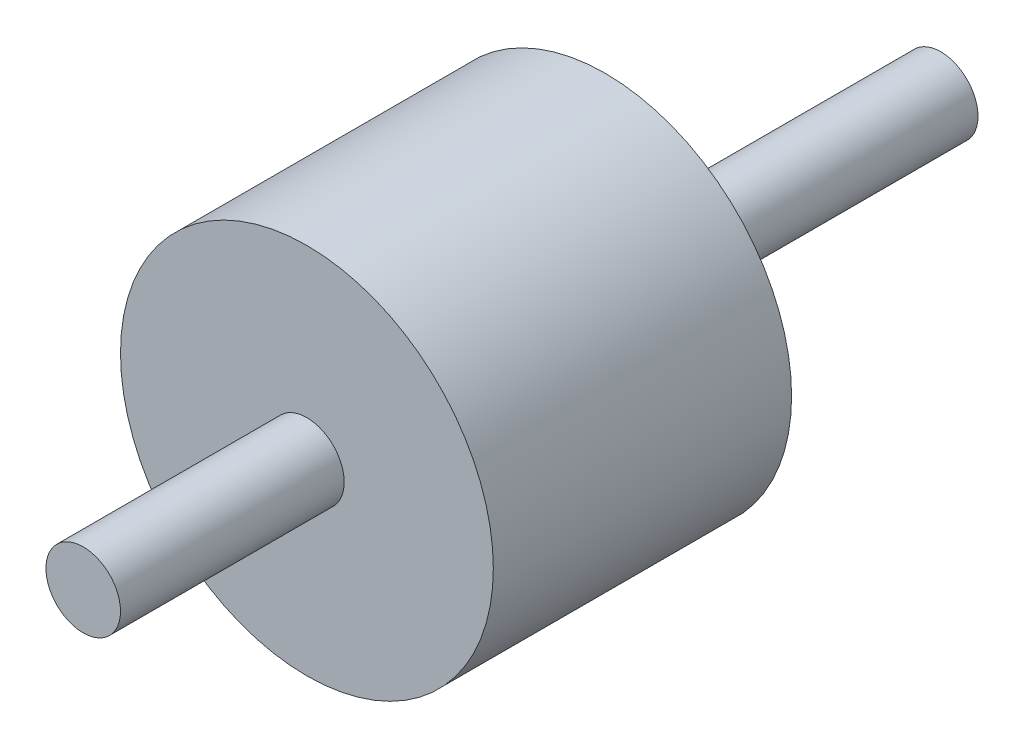
ISO-10303-21;
HEADER;
FILE_DESCRIPTION(('STEP AP214'),'2;1');
FILE_NAME('part.step','',(''),(''),'','','');
FILE_SCHEMA(('AUTOMOTIVE_DESIGN { 1 0 10303 214 1 1 1 1 }'));
ENDSEC;
DATA;
#1=APPLICATION_CONTEXT('core data for automotive mechanical design processes');
#2=APPLICATION_PROTOCOL_DEFINITION('international standard','automotive_design',2000,#1);
#3=PRODUCT_CONTEXT('',#1,'mechanical');
#4=PRODUCT('Part','Part','',(#3));
#5=PRODUCT_RELATED_PRODUCT_CATEGORY('part','',(#4));
#6=PRODUCT_DEFINITION_FORMATION('','',#4);
#7=PRODUCT_DEFINITION_CONTEXT('part definition',#1,'design');
#8=PRODUCT_DEFINITION('design','',#6,#7);
#9=PRODUCT_DEFINITION_SHAPE('','',#8);
#10=(LENGTH_UNIT() NAMED_UNIT(*) SI_UNIT(.MILLI.,.METRE.));
#11=(NAMED_UNIT(*) PLANE_ANGLE_UNIT() SI_UNIT($,.RADIAN.));
#12=(NAMED_UNIT(*) SI_UNIT($,.STERADIAN.) SOLID_ANGLE_UNIT());
#13=UNCERTAINTY_MEASURE_WITH_UNIT(LENGTH_MEASURE(1.E-05),#10,'distance_accuracy_value','');
#14=(GEOMETRIC_REPRESENTATION_CONTEXT(3) GLOBAL_UNCERTAINTY_ASSIGNED_CONTEXT((#13)) GLOBAL_UNIT_ASSIGNED_CONTEXT((#10,
#11,#12)) REPRESENTATION_CONTEXT('',''));
#15=CARTESIAN_POINT('',(0.,0.,0.));
#16=DIRECTION('',(0.,0.,1.));
#17=DIRECTION('',(1.,0.,0.));
#18=AXIS2_PLACEMENT_3D('',#15,#16,#17);
#19=CARTESIAN_POINT('',(0.,0.,45.));
#20=DIRECTION('',(0.,0.,1.));
#21=DIRECTION('',(1.,0.,0.));
#22=AXIS2_PLACEMENT_3D('',#19,#20,#21);
#23=CYLINDRICAL_SURFACE('',#22,25.);
#24=CARTESIAN_POINT('',(0.,0.,45.));
#25=DIRECTION('',(0.,0.,1.));
#26=DIRECTION('',(1.,0.,0.));
#27=AXIS2_PLACEMENT_3D('',#24,#25,#26);
#28=CIRCLE('',#27,25.);
#29=CARTESIAN_POINT('',(25.,0.,45.));
#30=VERTEX_POINT('',#29);
#31=EDGE_CURVE('E65',#30,#30,#28,.T.);
#32=ORIENTED_EDGE('',*,*,#31,.T.);
#33=EDGE_LOOP('',(#32));
#34=FACE_BOUND('',#33,.T.);
#35=CARTESIAN_POINT('',(0.,0.,85.));
#36=DIRECTION('',(0.,0.,1.));
#37=DIRECTION('',(1.,0.,0.));
#38=AXIS2_PLACEMENT_3D('',#35,#36,#37);
#39=CIRCLE('',#38,25.);
#40=CARTESIAN_POINT('',(25.,0.,85.));
#41=VERTEX_POINT('',#40);
#42=EDGE_CURVE('E61',#41,#41,#39,.T.);
#43=ORIENTED_EDGE('',*,*,#42,.F.);
#44=EDGE_LOOP('',(#43));
#45=FACE_BOUND('',#44,.T.);
#46=ADVANCED_FACE('F43',(#34,#45),#23,.T.);
#47=CARTESIAN_POINT('',(0.,0.,45.));
#48=DIRECTION('',(0.,0.,1.));
#49=DIRECTION('',(1.,0.,0.));
#50=AXIS2_PLACEMENT_3D('',#47,#48,#49);
#51=PLANE('',#50);
#52=CARTESIAN_POINT('',(0.,0.,45.));
#53=DIRECTION('',(0.,0.,-1.));
#54=DIRECTION('',(-1.,0.,0.));
#55=AXIS2_PLACEMENT_3D('',#52,#53,#54);
#56=CIRCLE('',#55,7.5);
#57=CARTESIAN_POINT('',(-7.5,0.,45.));
#58=VERTEX_POINT('',#57);
#59=EDGE_CURVE('E79',#58,#58,#56,.T.);
#60=ORIENTED_EDGE('',*,*,#59,.F.);
#61=EDGE_LOOP('',(#60));
#62=FACE_BOUND('',#61,.T.);
#63=ORIENTED_EDGE('',*,*,#31,.F.);
#64=EDGE_LOOP('',(#63));
#65=FACE_BOUND('',#64,.T.);
#66=ADVANCED_FACE('F108',(#62,#65),#51,.F.);
#67=CARTESIAN_POINT('',(0.,0.,85.));
#68=DIRECTION('',(0.,0.,1.));
#69=DIRECTION('',(1.,0.,0.));
#70=AXIS2_PLACEMENT_3D('',#67,#68,#69);
#71=PLANE('',#70);
#72=CARTESIAN_POINT('',(0.,0.,85.));
#73=DIRECTION('',(0.,0.,1.));
#74=DIRECTION('',(1.,0.,0.));
#75=AXIS2_PLACEMENT_3D('',#72,#73,#74);
#76=CIRCLE('',#75,5.);
#77=CARTESIAN_POINT('',(5.,0.,85.));
#78=VERTEX_POINT('',#77);
#79=EDGE_CURVE('E58',#78,#78,#76,.T.);
#80=ORIENTED_EDGE('',*,*,#79,.F.);
#81=EDGE_LOOP('',(#80));
#82=FACE_BOUND('',#81,.T.);
#83=ORIENTED_EDGE('',*,*,#42,.T.);
#84=EDGE_LOOP('',(#83));
#85=FACE_BOUND('',#84,.T.);
#86=ADVANCED_FACE('F114',(#82,#85),#71,.T.);
#87=CARTESIAN_POINT('',(0.,0.,115.));
#88=DIRECTION('',(0.,0.,1.));
#89=DIRECTION('',(1.,0.,0.));
#90=AXIS2_PLACEMENT_3D('',#87,#88,#89);
#91=PLANE('',#90);
#92=CARTESIAN_POINT('',(0.,0.,115.));
#93=DIRECTION('',(0.,0.,1.));
#94=DIRECTION('',(1.,0.,0.));
#95=AXIS2_PLACEMENT_3D('',#92,#93,#94);
#96=CIRCLE('',#95,5.);
#97=CARTESIAN_POINT('',(5.,0.,115.));
#98=VERTEX_POINT('',#97);
#99=EDGE_CURVE('E10',#98,#98,#96,.T.);
#100=ORIENTED_EDGE('',*,*,#99,.T.);
#101=EDGE_LOOP('',(#100));
#102=FACE_BOUND('',#101,.T.);
#103=ADVANCED_FACE('F105',(#102),#91,.T.);
#104=CARTESIAN_POINT('',(0.,0.,115.));
#105=DIRECTION('',(0.,0.,-1.));
#106=DIRECTION('',(-1.,0.,0.));
#107=AXIS2_PLACEMENT_3D('',#104,#105,#106);
#108=CYLINDRICAL_SURFACE('',#107,5.);
#109=ORIENTED_EDGE('',*,*,#79,.T.);
#110=EDGE_LOOP('',(#109));
#111=FACE_BOUND('',#110,.T.);
#112=ORIENTED_EDGE('',*,*,#99,.F.);
#113=EDGE_LOOP('',(#112));
#114=FACE_BOUND('',#113,.T.);
#115=ADVANCED_FACE('F45',(#111,#114),#108,.T.);
#116=CARTESIAN_POINT('',(0.,0.,45.));
#117=DIRECTION('',(0.,0.,-1.));
#118=DIRECTION('',(-1.,0.,0.));
#119=AXIS2_PLACEMENT_3D('',#116,#117,#118);
#120=CYLINDRICAL_SURFACE('',#119,7.5);
#121=ORIENTED_EDGE('',*,*,#59,.T.);
#122=EDGE_LOOP('',(#121));
#123=FACE_BOUND('',#122,.T.);
#124=CARTESIAN_POINT('',(0.,0.,35.));
#125=DIRECTION('',(0.,0.,-1.));
#126=DIRECTION('',(-1.,0.,0.));
#127=AXIS2_PLACEMENT_3D('',#124,#125,#126);
#128=CIRCLE('',#127,7.5);
#129=CARTESIAN_POINT('',(-7.5,0.,35.));
#130=VERTEX_POINT('',#129);
#131=EDGE_CURVE('E75',#130,#130,#128,.T.);
#132=ORIENTED_EDGE('',*,*,#131,.F.);
#133=EDGE_LOOP('',(#132));
#134=FACE_BOUND('',#133,.T.);
#135=ADVANCED_FACE('F95',(#123,#134),#120,.T.);
#136=CARTESIAN_POINT('',(0.,0.,35.));
#137=DIRECTION('',(0.,0.,-1.));
#138=DIRECTION('',(-1.,0.,0.));
#139=AXIS2_PLACEMENT_3D('',#136,#137,#138);
#140=PLANE('',#139);
#141=CARTESIAN_POINT('',(0.,0.,35.));
#142=DIRECTION('',(0.,0.,-1.));
#143=DIRECTION('',(-1.,0.,0.));
#144=AXIS2_PLACEMENT_3D('',#141,#142,#143);
#145=CIRCLE('',#144,5.);
#146=CARTESIAN_POINT('',(-5.,0.,35.));
#147=VERTEX_POINT('',#146);
#148=EDGE_CURVE('E47',#147,#147,#145,.T.);
#149=ORIENTED_EDGE('',*,*,#148,.F.);
#150=EDGE_LOOP('',(#149));
#151=FACE_BOUND('',#150,.T.);
#152=ORIENTED_EDGE('',*,*,#131,.T.);
#153=EDGE_LOOP('',(#152));
#154=FACE_BOUND('',#153,.T.);
#155=ADVANCED_FACE('F91',(#151,#154),#140,.T.);
#156=CARTESIAN_POINT('',(0.,0.,0.));
#157=DIRECTION('',(0.,0.,1.));
#158=DIRECTION('',(1.,0.,0.));
#159=AXIS2_PLACEMENT_3D('',#156,#157,#158);
#160=PLANE('',#159);
#161=CARTESIAN_POINT('',(0.,0.,0.));
#162=DIRECTION('',(0.,0.,1.));
#163=DIRECTION('',(1.,0.,0.));
#164=AXIS2_PLACEMENT_3D('',#161,#162,#163);
#165=CIRCLE('',#164,5.);
#166=CARTESIAN_POINT('',(5.,0.,0.));
#167=VERTEX_POINT('',#166);
#168=EDGE_CURVE('E52',#167,#167,#165,.T.);
#169=ORIENTED_EDGE('',*,*,#168,.F.);
#170=EDGE_LOOP('',(#169));
#171=FACE_BOUND('',#170,.T.);
#172=ADVANCED_FACE('F94',(#171),#160,.F.);
#173=ORIENTED_EDGE('',*,*,#148,.T.);
#174=EDGE_LOOP('',(#173));
#175=FACE_BOUND('',#174,.T.);
#176=ORIENTED_EDGE('',*,*,#168,.T.);
#177=EDGE_LOOP('',(#176));
#178=FACE_BOUND('',#177,.T.);
#179=ADVANCED_FACE('F88',(#175,#178),#108,.T.);
#180=CLOSED_SHELL('',(#46,#66,#86,#103,#115,#135,#155,#172,#179));
#181=MANIFOLD_SOLID_BREP('B2',#180);
#182=ADVANCED_BREP_SHAPE_REPRESENTATION('',(#18,#181),#14);
#183=SHAPE_DEFINITION_REPRESENTATION(#9,#182);
ENDSEC;
END-ISO-10303-21;
